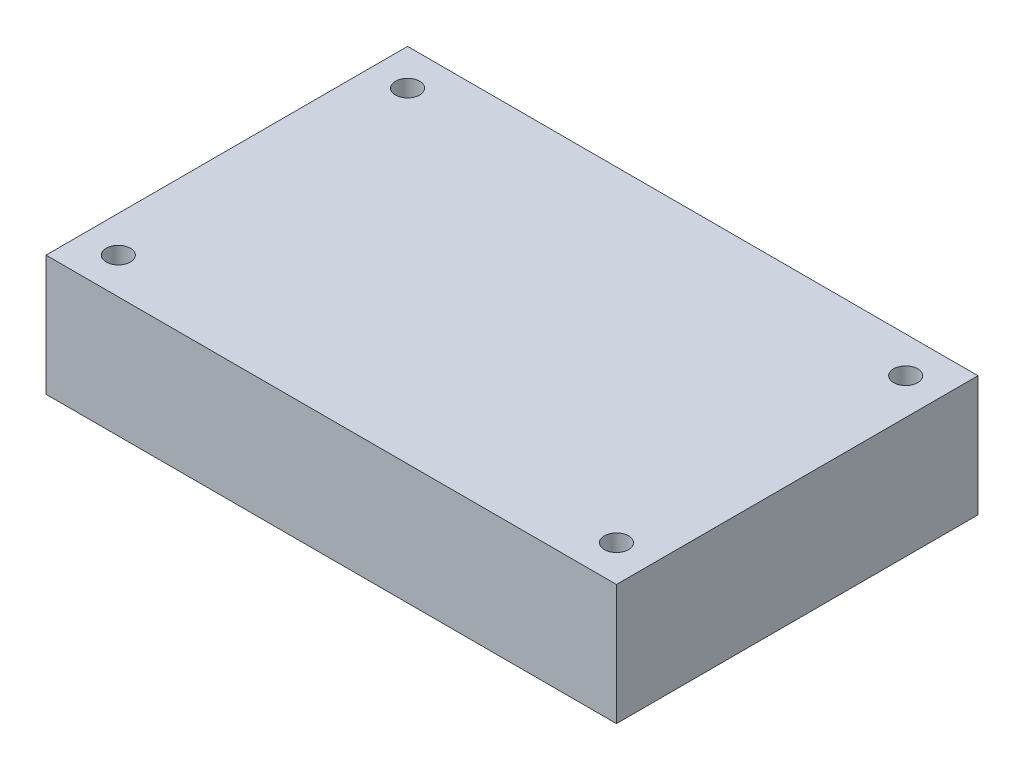
ISO-10303-21;
HEADER;
FILE_DESCRIPTION(('STEP AP214'),'2;1');
FILE_NAME('part.step','',(''),(''),'','','');
FILE_SCHEMA(('AUTOMOTIVE_DESIGN { 1 0 10303 214 1 1 1 1 }'));
ENDSEC;
DATA;
#1=APPLICATION_CONTEXT('core data for automotive mechanical design processes');
#2=APPLICATION_PROTOCOL_DEFINITION('international standard','automotive_design',2000,#1);
#3=PRODUCT_CONTEXT('',#1,'mechanical');
#4=PRODUCT('Part','Part','',(#3));
#5=PRODUCT_RELATED_PRODUCT_CATEGORY('part','',(#4));
#6=PRODUCT_DEFINITION_FORMATION('','',#4);
#7=PRODUCT_DEFINITION_CONTEXT('part definition',#1,'design');
#8=PRODUCT_DEFINITION('design','',#6,#7);
#9=PRODUCT_DEFINITION_SHAPE('','',#8);
#10=(LENGTH_UNIT() NAMED_UNIT(*) SI_UNIT(.MILLI.,.METRE.));
#11=(NAMED_UNIT(*) PLANE_ANGLE_UNIT() SI_UNIT($,.RADIAN.));
#12=(NAMED_UNIT(*) SI_UNIT($,.STERADIAN.) SOLID_ANGLE_UNIT());
#13=UNCERTAINTY_MEASURE_WITH_UNIT(LENGTH_MEASURE(1.E-05),#10,'distance_accuracy_value','');
#14=(GEOMETRIC_REPRESENTATION_CONTEXT(3) GLOBAL_UNCERTAINTY_ASSIGNED_CONTEXT((#13)) GLOBAL_UNIT_ASSIGNED_CONTEXT((#10,
#11,#12)) REPRESENTATION_CONTEXT('',''));
#15=CARTESIAN_POINT('',(0.,0.,0.));
#16=DIRECTION('',(0.,0.,1.));
#17=DIRECTION('',(1.,0.,0.));
#18=AXIS2_PLACEMENT_3D('',#15,#16,#17);
#19=CARTESIAN_POINT('',(0.,15.,0.));
#20=DIRECTION('',(0.,-1.,0.));
#21=DIRECTION('',(0.,0.,-1.));
#22=AXIS2_PLACEMENT_3D('',#19,#20,#21);
#23=PLANE('',#22);
#24=DIRECTION('',(0.,0.,1.));
#25=VECTOR('',#24,1.);
#26=CARTESIAN_POINT('',(0.,15.,0.));
#27=LINE('',#26,#25);
#28=CARTESIAN_POINT('',(0.,15.,-45.));
#29=VERTEX_POINT('',#28);
#30=CARTESIAN_POINT('',(0.,15.,0.));
#31=VERTEX_POINT('',#30);
#32=EDGE_CURVE('E93',#29,#31,#27,.T.);
#33=ORIENTED_EDGE('',*,*,#32,.T.);
#34=DIRECTION('',(1.,0.,0.));
#35=VECTOR('',#34,1.);
#36=CARTESIAN_POINT('',(0.,15.,0.));
#37=LINE('',#36,#35);
#38=CARTESIAN_POINT('',(71.,15.,0.));
#39=VERTEX_POINT('',#38);
#40=EDGE_CURVE('E88',#31,#39,#37,.T.);
#41=ORIENTED_EDGE('',*,*,#40,.T.);
#42=DIRECTION('',(0.,0.,-1.));
#43=VECTOR('',#42,1.);
#44=CARTESIAN_POINT('',(71.,15.,0.));
#45=LINE('',#44,#43);
#46=CARTESIAN_POINT('',(71.,15.,-45.));
#47=VERTEX_POINT('',#46);
#48=EDGE_CURVE('E91',#39,#47,#45,.T.);
#49=ORIENTED_EDGE('',*,*,#48,.T.);
#50=DIRECTION('',(-1.,0.,0.));
#51=VECTOR('',#50,1.);
#52=CARTESIAN_POINT('',(0.,15.,-45.));
#53=LINE('',#52,#51);
#54=EDGE_CURVE('E58',#47,#29,#53,.T.);
#55=ORIENTED_EDGE('',*,*,#54,.T.);
#56=EDGE_LOOP('',(#33,#41,#49,#55));
#57=FACE_BOUND('',#56,.T.);
#58=CARTESIAN_POINT('',(4.5,15.,-4.5));
#59=DIRECTION('',(0.,1.,0.));
#60=DIRECTION('',(0.,0.,1.));
#61=AXIS2_PLACEMENT_3D('',#58,#59,#60);
#62=CIRCLE('',#61,1.5);
#63=CARTESIAN_POINT('',(4.5,15.,-3.));
#64=VERTEX_POINT('',#63);
#65=EDGE_CURVE('E108',#64,#64,#62,.T.);
#66=ORIENTED_EDGE('',*,*,#65,.F.);
#67=EDGE_LOOP('',(#66));
#68=FACE_BOUND('',#67,.T.);
#69=CARTESIAN_POINT('',(4.5,15.,-40.5));
#70=DIRECTION('',(0.,1.,0.));
#71=DIRECTION('',(0.,0.,1.));
#72=AXIS2_PLACEMENT_3D('',#69,#70,#71);
#73=CIRCLE('',#72,1.5);
#74=CARTESIAN_POINT('',(4.5,15.,-39.));
#75=VERTEX_POINT('',#74);
#76=EDGE_CURVE('E123',#75,#75,#73,.T.);
#77=ORIENTED_EDGE('',*,*,#76,.F.);
#78=EDGE_LOOP('',(#77));
#79=FACE_BOUND('',#78,.T.);
#80=CARTESIAN_POINT('',(66.5,15.,-40.5));
#81=DIRECTION('',(0.,1.,0.));
#82=DIRECTION('',(0.,0.,1.));
#83=AXIS2_PLACEMENT_3D('',#80,#81,#82);
#84=CIRCLE('',#83,1.5);
#85=CARTESIAN_POINT('',(66.5,15.,-39.));
#86=VERTEX_POINT('',#85);
#87=EDGE_CURVE('E129',#86,#86,#84,.T.);
#88=ORIENTED_EDGE('',*,*,#87,.F.);
#89=EDGE_LOOP('',(#88));
#90=FACE_BOUND('',#89,.T.);
#91=CARTESIAN_POINT('',(66.5,15.,-4.5));
#92=DIRECTION('',(0.,1.,0.));
#93=DIRECTION('',(0.,0.,1.));
#94=AXIS2_PLACEMENT_3D('',#91,#92,#93);
#95=CIRCLE('',#94,1.5);
#96=CARTESIAN_POINT('',(66.5,15.,-3.));
#97=VERTEX_POINT('',#96);
#98=EDGE_CURVE('E135',#97,#97,#95,.T.);
#99=ORIENTED_EDGE('',*,*,#98,.F.);
#100=EDGE_LOOP('',(#99));
#101=FACE_BOUND('',#100,.T.);
#102=ADVANCED_FACE('F41',(#57,#68,#79,#90,#101),#23,.F.);
#103=CARTESIAN_POINT('',(0.,0.,0.));
#104=DIRECTION('',(0.,-1.,0.));
#105=DIRECTION('',(0.,0.,-1.));
#106=AXIS2_PLACEMENT_3D('',#103,#104,#105);
#107=PLANE('',#106);
#108=CARTESIAN_POINT('',(66.5,0.,-40.5));
#109=DIRECTION('',(0.,1.,0.));
#110=DIRECTION('',(0.,0.,1.));
#111=AXIS2_PLACEMENT_3D('',#108,#109,#110);
#112=CIRCLE('',#111,1.5);
#113=CARTESIAN_POINT('',(66.5,0.,-39.));
#114=VERTEX_POINT('',#113);
#115=EDGE_CURVE('E132',#114,#114,#112,.T.);
#116=ORIENTED_EDGE('',*,*,#115,.T.);
#117=EDGE_LOOP('',(#116));
#118=FACE_BOUND('',#117,.T.);
#119=CARTESIAN_POINT('',(4.5,0.,-4.5));
#120=DIRECTION('',(0.,1.,0.));
#121=DIRECTION('',(0.,0.,1.));
#122=AXIS2_PLACEMENT_3D('',#119,#120,#121);
#123=CIRCLE('',#122,1.5);
#124=CARTESIAN_POINT('',(4.5,0.,-3.));
#125=VERTEX_POINT('',#124);
#126=EDGE_CURVE('E120',#125,#125,#123,.T.);
#127=ORIENTED_EDGE('',*,*,#126,.T.);
#128=EDGE_LOOP('',(#127));
#129=FACE_BOUND('',#128,.T.);
#130=DIRECTION('',(0.,0.,1.));
#131=VECTOR('',#130,1.);
#132=CARTESIAN_POINT('',(0.,0.,0.));
#133=LINE('',#132,#131);
#134=CARTESIAN_POINT('',(0.,0.,-45.));
#135=VERTEX_POINT('',#134);
#136=CARTESIAN_POINT('',(0.,0.,0.));
#137=VERTEX_POINT('',#136);
#138=EDGE_CURVE('E105',#135,#137,#133,.T.);
#139=ORIENTED_EDGE('',*,*,#138,.F.);
#140=DIRECTION('',(-1.,0.,0.));
#141=VECTOR('',#140,1.);
#142=CARTESIAN_POINT('',(0.,0.,-45.));
#143=LINE('',#142,#141);
#144=CARTESIAN_POINT('',(71.,0.,-45.));
#145=VERTEX_POINT('',#144);
#146=EDGE_CURVE('E81',#145,#135,#143,.T.);
#147=ORIENTED_EDGE('',*,*,#146,.F.);
#148=DIRECTION('',(0.,0.,-1.));
#149=VECTOR('',#148,1.);
#150=CARTESIAN_POINT('',(71.,0.,0.));
#151=LINE('',#150,#149);
#152=CARTESIAN_POINT('',(71.,0.,0.));
#153=VERTEX_POINT('',#152);
#154=EDGE_CURVE('E75',#153,#145,#151,.T.);
#155=ORIENTED_EDGE('',*,*,#154,.F.);
#156=DIRECTION('',(1.,0.,0.));
#157=VECTOR('',#156,1.);
#158=CARTESIAN_POINT('',(0.,0.,0.));
#159=LINE('',#158,#157);
#160=EDGE_CURVE('E97',#137,#153,#159,.T.);
#161=ORIENTED_EDGE('',*,*,#160,.F.);
#162=EDGE_LOOP('',(#139,#147,#155,#161));
#163=FACE_BOUND('',#162,.T.);
#164=CARTESIAN_POINT('',(4.5,0.,-40.5));
#165=DIRECTION('',(0.,1.,0.));
#166=DIRECTION('',(0.,0.,1.));
#167=AXIS2_PLACEMENT_3D('',#164,#165,#166);
#168=CIRCLE('',#167,1.5);
#169=CARTESIAN_POINT('',(4.5,0.,-39.));
#170=VERTEX_POINT('',#169);
#171=EDGE_CURVE('E126',#170,#170,#168,.T.);
#172=ORIENTED_EDGE('',*,*,#171,.T.);
#173=EDGE_LOOP('',(#172));
#174=FACE_BOUND('',#173,.T.);
#175=CARTESIAN_POINT('',(66.5,0.,-4.5));
#176=DIRECTION('',(0.,1.,0.));
#177=DIRECTION('',(0.,0.,1.));
#178=AXIS2_PLACEMENT_3D('',#175,#176,#177);
#179=CIRCLE('',#178,1.5);
#180=CARTESIAN_POINT('',(66.5,0.,-3.));
#181=VERTEX_POINT('',#180);
#182=EDGE_CURVE('E138',#181,#181,#179,.T.);
#183=ORIENTED_EDGE('',*,*,#182,.T.);
#184=EDGE_LOOP('',(#183));
#185=FACE_BOUND('',#184,.T.);
#186=ADVANCED_FACE('F116',(#118,#129,#163,#174,#185),#107,.T.);
#187=CARTESIAN_POINT('',(0.,15.,0.));
#188=DIRECTION('',(1.,0.,0.));
#189=DIRECTION('',(0.,0.,-1.));
#190=AXIS2_PLACEMENT_3D('',#187,#188,#189);
#191=PLANE('',#190);
#192=ORIENTED_EDGE('',*,*,#138,.T.);
#193=DIRECTION('',(0.,-1.,0.));
#194=VECTOR('',#193,1.);
#195=CARTESIAN_POINT('',(0.,15.,0.));
#196=LINE('',#195,#194);
#197=EDGE_CURVE('E11',#31,#137,#196,.T.);
#198=ORIENTED_EDGE('',*,*,#197,.F.);
#199=ORIENTED_EDGE('',*,*,#32,.F.);
#200=DIRECTION('',(0.,-1.,0.));
#201=VECTOR('',#200,1.);
#202=CARTESIAN_POINT('',(0.,15.,-45.));
#203=LINE('',#202,#201);
#204=EDGE_CURVE('E101',#29,#135,#203,.T.);
#205=ORIENTED_EDGE('',*,*,#204,.T.);
#206=EDGE_LOOP('',(#192,#198,#199,#205));
#207=FACE_BOUND('',#206,.T.);
#208=ADVANCED_FACE('F43',(#207),#191,.F.);
#209=CARTESIAN_POINT('',(0.,15.,0.));
#210=DIRECTION('',(0.,0.,-1.));
#211=DIRECTION('',(-1.,0.,0.));
#212=AXIS2_PLACEMENT_3D('',#209,#210,#211);
#213=PLANE('',#212);
#214=ORIENTED_EDGE('',*,*,#160,.T.);
#215=DIRECTION('',(0.,-1.,0.));
#216=VECTOR('',#215,1.);
#217=CARTESIAN_POINT('',(71.,15.,0.));
#218=LINE('',#217,#216);
#219=EDGE_CURVE('E50',#39,#153,#218,.T.);
#220=ORIENTED_EDGE('',*,*,#219,.F.);
#221=ORIENTED_EDGE('',*,*,#40,.F.);
#222=ORIENTED_EDGE('',*,*,#197,.T.);
#223=EDGE_LOOP('',(#214,#220,#221,#222));
#224=FACE_BOUND('',#223,.T.);
#225=ADVANCED_FACE('F96',(#224),#213,.F.);
#226=CARTESIAN_POINT('',(71.,15.,0.));
#227=DIRECTION('',(-1.,0.,0.));
#228=DIRECTION('',(0.,0.,1.));
#229=AXIS2_PLACEMENT_3D('',#226,#227,#228);
#230=PLANE('',#229);
#231=ORIENTED_EDGE('',*,*,#154,.T.);
#232=DIRECTION('',(0.,-1.,0.));
#233=VECTOR('',#232,1.);
#234=CARTESIAN_POINT('',(71.,15.,-45.));
#235=LINE('',#234,#233);
#236=EDGE_CURVE('E98',#47,#145,#235,.T.);
#237=ORIENTED_EDGE('',*,*,#236,.F.);
#238=ORIENTED_EDGE('',*,*,#48,.F.);
#239=ORIENTED_EDGE('',*,*,#219,.T.);
#240=EDGE_LOOP('',(#231,#237,#238,#239));
#241=FACE_BOUND('',#240,.T.);
#242=ADVANCED_FACE('F99',(#241),#230,.F.);
#243=CARTESIAN_POINT('',(0.,15.,-45.));
#244=DIRECTION('',(0.,0.,1.));
#245=DIRECTION('',(1.,0.,0.));
#246=AXIS2_PLACEMENT_3D('',#243,#244,#245);
#247=PLANE('',#246);
#248=ORIENTED_EDGE('',*,*,#146,.T.);
#249=ORIENTED_EDGE('',*,*,#204,.F.);
#250=ORIENTED_EDGE('',*,*,#54,.F.);
#251=ORIENTED_EDGE('',*,*,#236,.T.);
#252=EDGE_LOOP('',(#248,#249,#250,#251));
#253=FACE_BOUND('',#252,.T.);
#254=ADVANCED_FACE('F113',(#253),#247,.F.);
#255=CARTESIAN_POINT('',(4.5,15.,-4.5));
#256=DIRECTION('',(0.,-1.,0.));
#257=DIRECTION('',(0.,0.,-1.));
#258=AXIS2_PLACEMENT_3D('',#255,#256,#257);
#259=CYLINDRICAL_SURFACE('',#258,1.5);
#260=ORIENTED_EDGE('',*,*,#65,.T.);
#261=EDGE_LOOP('',(#260));
#262=FACE_BOUND('',#261,.T.);
#263=ORIENTED_EDGE('',*,*,#126,.F.);
#264=EDGE_LOOP('',(#263));
#265=FACE_BOUND('',#264,.T.);
#266=ADVANCED_FACE('F155',(#262,#265),#259,.F.);
#267=CARTESIAN_POINT('',(4.5,15.,-40.5));
#268=DIRECTION('',(0.,-1.,0.));
#269=DIRECTION('',(0.,0.,-1.));
#270=AXIS2_PLACEMENT_3D('',#267,#268,#269);
#271=CYLINDRICAL_SURFACE('',#270,1.5);
#272=ORIENTED_EDGE('',*,*,#76,.T.);
#273=EDGE_LOOP('',(#272));
#274=FACE_BOUND('',#273,.T.);
#275=ORIENTED_EDGE('',*,*,#171,.F.);
#276=EDGE_LOOP('',(#275));
#277=FACE_BOUND('',#276,.T.);
#278=ADVANCED_FACE('F200',(#274,#277),#271,.F.);
#279=CARTESIAN_POINT('',(66.5,15.,-40.5));
#280=DIRECTION('',(0.,-1.,0.));
#281=DIRECTION('',(0.,0.,-1.));
#282=AXIS2_PLACEMENT_3D('',#279,#280,#281);
#283=CYLINDRICAL_SURFACE('',#282,1.5);
#284=ORIENTED_EDGE('',*,*,#87,.T.);
#285=EDGE_LOOP('',(#284));
#286=FACE_BOUND('',#285,.T.);
#287=ORIENTED_EDGE('',*,*,#115,.F.);
#288=EDGE_LOOP('',(#287));
#289=FACE_BOUND('',#288,.T.);
#290=ADVANCED_FACE('F208',(#286,#289),#283,.F.);
#291=CARTESIAN_POINT('',(66.5,15.,-4.5));
#292=DIRECTION('',(0.,-1.,0.));
#293=DIRECTION('',(0.,0.,-1.));
#294=AXIS2_PLACEMENT_3D('',#291,#292,#293);
#295=CYLINDRICAL_SURFACE('',#294,1.5);
#296=ORIENTED_EDGE('',*,*,#98,.T.);
#297=EDGE_LOOP('',(#296));
#298=FACE_BOUND('',#297,.T.);
#299=ORIENTED_EDGE('',*,*,#182,.F.);
#300=EDGE_LOOP('',(#299));
#301=FACE_BOUND('',#300,.T.);
#302=ADVANCED_FACE('F144',(#298,#301),#295,.F.);
#303=CLOSED_SHELL('',(#102,#186,#208,#225,#242,#254,#266,#278,#290,#302));
#304=MANIFOLD_SOLID_BREP('B2',#303);
#305=ADVANCED_BREP_SHAPE_REPRESENTATION('',(#18,#304),#14);
#306=SHAPE_DEFINITION_REPRESENTATION(#9,#305);
ENDSEC;
END-ISO-10303-21;
